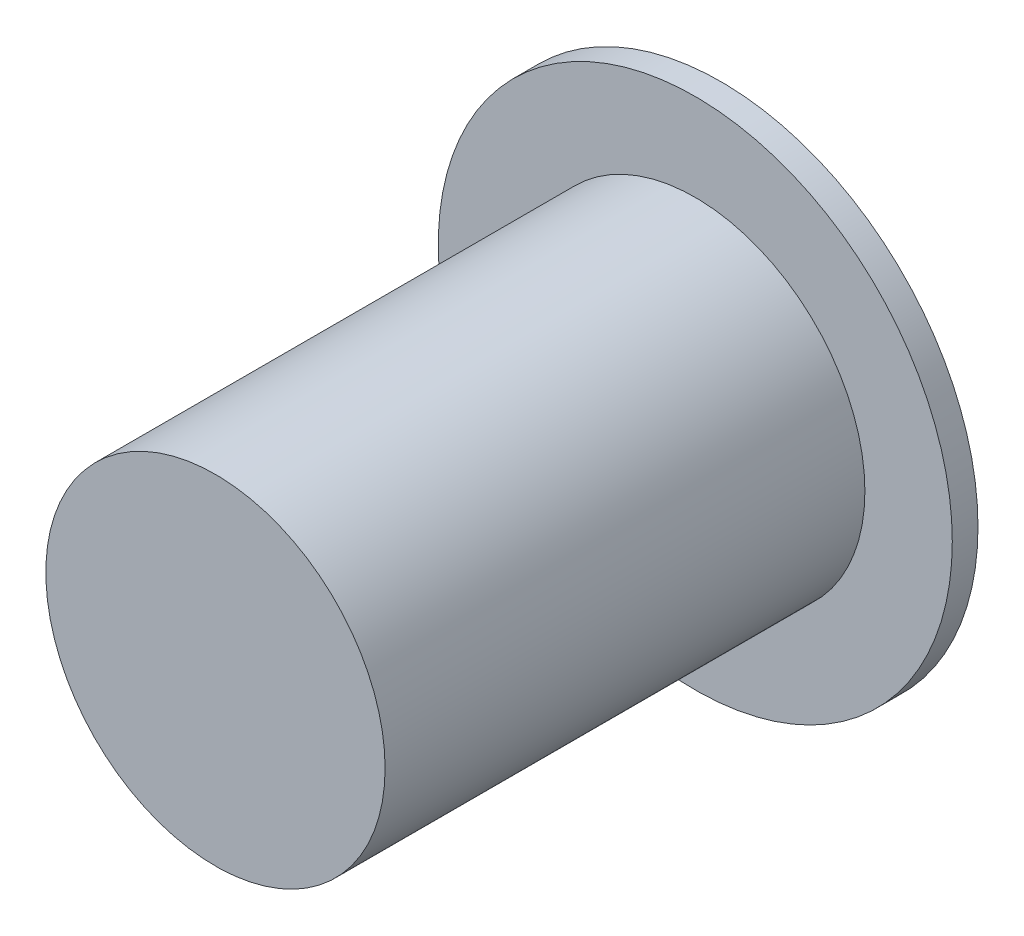
ISO-10303-21;
HEADER;
FILE_DESCRIPTION(('STEP AP214'),'2;1');
FILE_NAME('part.step','',(''),(''),'','','');
FILE_SCHEMA(('AUTOMOTIVE_DESIGN { 1 0 10303 214 1 1 1 1 }'));
ENDSEC;
DATA;
#1=APPLICATION_CONTEXT('core data for automotive mechanical design processes');
#2=APPLICATION_PROTOCOL_DEFINITION('international standard','automotive_design',2000,#1);
#3=PRODUCT_CONTEXT('',#1,'mechanical');
#4=PRODUCT('Part','Part','',(#3));
#5=PRODUCT_RELATED_PRODUCT_CATEGORY('part','',(#4));
#6=PRODUCT_DEFINITION_FORMATION('','',#4);
#7=PRODUCT_DEFINITION_CONTEXT('part definition',#1,'design');
#8=PRODUCT_DEFINITION('design','',#6,#7);
#9=PRODUCT_DEFINITION_SHAPE('','',#8);
#10=(LENGTH_UNIT() NAMED_UNIT(*) SI_UNIT(.MILLI.,.METRE.));
#11=(NAMED_UNIT(*) PLANE_ANGLE_UNIT() SI_UNIT($,.RADIAN.));
#12=(NAMED_UNIT(*) SI_UNIT($,.STERADIAN.) SOLID_ANGLE_UNIT());
#13=UNCERTAINTY_MEASURE_WITH_UNIT(LENGTH_MEASURE(1.E-05),#10,'distance_accuracy_value','');
#14=(GEOMETRIC_REPRESENTATION_CONTEXT(3) GLOBAL_UNCERTAINTY_ASSIGNED_CONTEXT((#13)) GLOBAL_UNIT_ASSIGNED_CONTEXT((#10,
#11,#12)) REPRESENTATION_CONTEXT('',''));
#15=CARTESIAN_POINT('',(0.,0.,0.));
#16=DIRECTION('',(0.,0.,1.));
#17=DIRECTION('',(1.,0.,0.));
#18=AXIS2_PLACEMENT_3D('',#15,#16,#17);
#19=CARTESIAN_POINT('',(0.,0.,1.5));
#20=DIRECTION('',(0.,0.,-1.));
#21=DIRECTION('',(-1.,0.,0.));
#22=AXIS2_PLACEMENT_3D('',#19,#20,#21);
#23=CYLINDRICAL_SURFACE('',#22,15.);
#24=CARTESIAN_POINT('',(0.,0.,1.5));
#25=DIRECTION('',(0.,0.,1.));
#26=DIRECTION('',(1.,0.,0.));
#27=AXIS2_PLACEMENT_3D('',#24,#25,#26);
#28=CIRCLE('',#27,15.);
#29=CARTESIAN_POINT('',(15.,0.,1.5));
#30=VERTEX_POINT('',#29);
#31=EDGE_CURVE('E45',#30,#30,#28,.T.);
#32=ORIENTED_EDGE('',*,*,#31,.F.);
#33=EDGE_LOOP('',(#32));
#34=FACE_BOUND('',#33,.T.);
#35=CARTESIAN_POINT('',(0.,0.,0.));
#36=DIRECTION('',(0.,0.,1.));
#37=DIRECTION('',(1.,0.,0.));
#38=AXIS2_PLACEMENT_3D('',#35,#36,#37);
#39=CIRCLE('',#38,15.);
#40=CARTESIAN_POINT('',(15.,0.,0.));
#41=VERTEX_POINT('',#40);
#42=EDGE_CURVE('E41',#41,#41,#39,.T.);
#43=ORIENTED_EDGE('',*,*,#42,.T.);
#44=EDGE_LOOP('',(#43));
#45=FACE_BOUND('',#44,.T.);
#46=ADVANCED_FACE('F38',(#34,#45),#23,.T.);
#47=CARTESIAN_POINT('',(0.,0.,1.5));
#48=DIRECTION('',(0.,0.,1.));
#49=DIRECTION('',(1.,0.,0.));
#50=AXIS2_PLACEMENT_3D('',#47,#48,#49);
#51=PLANE('',#50);
#52=CARTESIAN_POINT('',(0.,0.,1.5));
#53=DIRECTION('',(0.,0.,1.));
#54=DIRECTION('',(1.,0.,0.));
#55=AXIS2_PLACEMENT_3D('',#52,#53,#54);
#56=CIRCLE('',#55,9.9);
#57=CARTESIAN_POINT('',(9.9,0.,1.5));
#58=VERTEX_POINT('',#57);
#59=EDGE_CURVE('E10',#58,#58,#56,.T.);
#60=ORIENTED_EDGE('',*,*,#59,.F.);
#61=EDGE_LOOP('',(#60));
#62=FACE_BOUND('',#61,.T.);
#63=ORIENTED_EDGE('',*,*,#31,.T.);
#64=EDGE_LOOP('',(#63));
#65=FACE_BOUND('',#64,.T.);
#66=ADVANCED_FACE('F62',(#62,#65),#51,.T.);
#67=CARTESIAN_POINT('',(0.,0.,0.));
#68=DIRECTION('',(0.,0.,1.));
#69=DIRECTION('',(1.,0.,0.));
#70=AXIS2_PLACEMENT_3D('',#67,#68,#69);
#71=PLANE('',#70);
#72=ORIENTED_EDGE('',*,*,#42,.F.);
#73=EDGE_LOOP('',(#72));
#74=FACE_BOUND('',#73,.T.);
#75=ADVANCED_FACE('F59',(#74),#71,.F.);
#76=CARTESIAN_POINT('',(0.,0.,29.5));
#77=DIRECTION('',(0.,0.,-1.));
#78=DIRECTION('',(-1.,0.,0.));
#79=AXIS2_PLACEMENT_3D('',#76,#77,#78);
#80=CYLINDRICAL_SURFACE('',#79,9.9);
#81=CARTESIAN_POINT('',(0.,0.,29.5));
#82=DIRECTION('',(0.,0.,1.));
#83=DIRECTION('',(1.,0.,0.));
#84=AXIS2_PLACEMENT_3D('',#81,#82,#83);
#85=CIRCLE('',#84,9.9);
#86=CARTESIAN_POINT('',(9.9,0.,29.5));
#87=VERTEX_POINT('',#86);
#88=EDGE_CURVE('E51',#87,#87,#85,.T.);
#89=ORIENTED_EDGE('',*,*,#88,.F.);
#90=EDGE_LOOP('',(#89));
#91=FACE_BOUND('',#90,.T.);
#92=ORIENTED_EDGE('',*,*,#59,.T.);
#93=EDGE_LOOP('',(#92));
#94=FACE_BOUND('',#93,.T.);
#95=ADVANCED_FACE('F61',(#91,#94),#80,.T.);
#96=CARTESIAN_POINT('',(0.,0.,29.5));
#97=DIRECTION('',(0.,0.,1.));
#98=DIRECTION('',(1.,0.,0.));
#99=AXIS2_PLACEMENT_3D('',#96,#97,#98);
#100=PLANE('',#99);
#101=ORIENTED_EDGE('',*,*,#88,.T.);
#102=EDGE_LOOP('',(#101));
#103=FACE_BOUND('',#102,.T.);
#104=ADVANCED_FACE('F67',(#103),#100,.T.);
#105=CLOSED_SHELL('',(#46,#66,#75,#95,#104));
#106=MANIFOLD_SOLID_BREP('B2',#105);
#107=ADVANCED_BREP_SHAPE_REPRESENTATION('',(#18,#106),#14);
#108=SHAPE_DEFINITION_REPRESENTATION(#9,#107);
ENDSEC;
END-ISO-10303-21;
